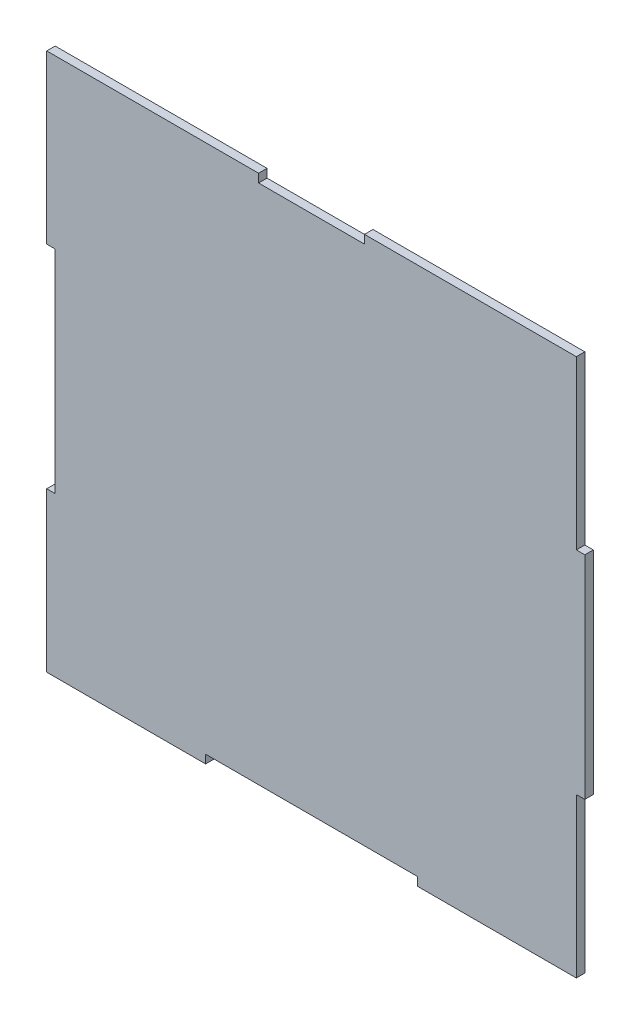
ISO-10303-21;
HEADER;
FILE_DESCRIPTION(('STEP AP214'),'2;1');
FILE_NAME('part.step','',(''),(''),'','','');
FILE_SCHEMA(('AUTOMOTIVE_DESIGN { 1 0 10303 214 1 1 1 1 }'));
ENDSEC;
DATA;
#1=APPLICATION_CONTEXT('core data for automotive mechanical design processes');
#2=APPLICATION_PROTOCOL_DEFINITION('international standard','automotive_design',2000,#1);
#3=PRODUCT_CONTEXT('',#1,'mechanical');
#4=PRODUCT('Part','Part','',(#3));
#5=PRODUCT_RELATED_PRODUCT_CATEGORY('part','',(#4));
#6=PRODUCT_DEFINITION_FORMATION('','',#4);
#7=PRODUCT_DEFINITION_CONTEXT('part definition',#1,'design');
#8=PRODUCT_DEFINITION('design','',#6,#7);
#9=PRODUCT_DEFINITION_SHAPE('','',#8);
#10=(LENGTH_UNIT() NAMED_UNIT(*) SI_UNIT(.MILLI.,.METRE.));
#11=(NAMED_UNIT(*) PLANE_ANGLE_UNIT() SI_UNIT($,.RADIAN.));
#12=(NAMED_UNIT(*) SI_UNIT($,.STERADIAN.) SOLID_ANGLE_UNIT());
#13=UNCERTAINTY_MEASURE_WITH_UNIT(LENGTH_MEASURE(1.E-05),#10,'distance_accuracy_value','');
#14=(GEOMETRIC_REPRESENTATION_CONTEXT(3) GLOBAL_UNCERTAINTY_ASSIGNED_CONTEXT((#13)) GLOBAL_UNIT_ASSIGNED_CONTEXT((#10,
#11,#12)) REPRESENTATION_CONTEXT('',''));
#15=CARTESIAN_POINT('',(0.,0.,0.));
#16=DIRECTION('',(0.,0.,1.));
#17=DIRECTION('',(1.,0.,0.));
#18=AXIS2_PLACEMENT_3D('',#15,#16,#17);
#19=CARTESIAN_POINT('',(-77.1815206878133,-124.72771896828,4.));
#20=DIRECTION('',(0.,1.,0.));
#21=DIRECTION('',(0.,0.,1.));
#22=AXIS2_PLACEMENT_3D('',#19,#20,#21);
#23=PLANE('',#22);
#24=DIRECTION('',(1.,0.,0.));
#25=VECTOR('',#24,1.);
#26=CARTESIAN_POINT('',(-77.1815206878133,-124.72771896828,0.));
#27=LINE('',#26,#25);
#28=CARTESIAN_POINT('',(-77.1815206878133,-124.72771896828,0.));
#29=VERTEX_POINT('',#28);
#30=CARTESIAN_POINT('',(-2.18152068781335,-124.72771896828,0.));
#31=VERTEX_POINT('',#30);
#32=EDGE_CURVE('E211',#29,#31,#27,.T.);
#33=ORIENTED_EDGE('',*,*,#32,.T.);
#34=DIRECTION('',(0.,0.,-1.));
#35=VECTOR('',#34,1.);
#36=CARTESIAN_POINT('',(-2.18152068781335,-124.72771896828,4.));
#37=LINE('',#36,#35);
#38=CARTESIAN_POINT('',(-2.18152068781335,-124.72771896828,4.));
#39=VERTEX_POINT('',#38);
#40=EDGE_CURVE('E11',#39,#31,#37,.T.);
#41=ORIENTED_EDGE('',*,*,#40,.F.);
#42=DIRECTION('',(1.,0.,0.));
#43=VECTOR('',#42,1.);
#44=CARTESIAN_POINT('',(-77.1815206878133,-124.72771896828,4.));
#45=LINE('',#44,#43);
#46=CARTESIAN_POINT('',(-77.1815206878133,-124.72771896828,4.));
#47=VERTEX_POINT('',#46);
#48=EDGE_CURVE('E251',#47,#39,#45,.T.);
#49=ORIENTED_EDGE('',*,*,#48,.F.);
#50=DIRECTION('',(0.,0.,-1.));
#51=VECTOR('',#50,1.);
#52=CARTESIAN_POINT('',(-77.1815206878133,-124.72771896828,4.));
#53=LINE('',#52,#51);
#54=EDGE_CURVE('E207',#47,#29,#53,.T.);
#55=ORIENTED_EDGE('',*,*,#54,.T.);
#56=EDGE_LOOP('',(#33,#41,#49,#55));
#57=FACE_BOUND('',#56,.T.);
#58=ADVANCED_FACE('F43',(#57),#23,.F.);
#59=CARTESIAN_POINT('',(-2.18152068781335,-124.72771896828,4.));
#60=DIRECTION('',(-1.,0.,0.));
#61=DIRECTION('',(0.,0.,1.));
#62=AXIS2_PLACEMENT_3D('',#59,#60,#61);
#63=PLANE('',#62);
#64=DIRECTION('',(0.,1.,0.));
#65=VECTOR('',#64,1.);
#66=CARTESIAN_POINT('',(-2.18152068781335,-124.72771896828,0.));
#67=LINE('',#66,#65);
#68=CARTESIAN_POINT('',(-2.18152068781335,-49.72771896828,0.));
#69=VERTEX_POINT('',#68);
#70=EDGE_CURVE('E214',#31,#69,#67,.T.);
#71=ORIENTED_EDGE('',*,*,#70,.T.);
#72=DIRECTION('',(0.,0.,-1.));
#73=VECTOR('',#72,1.);
#74=CARTESIAN_POINT('',(-2.18152068781335,-49.72771896828,4.));
#75=LINE('',#74,#73);
#76=CARTESIAN_POINT('',(-2.18152068781335,-49.72771896828,4.));
#77=VERTEX_POINT('',#76);
#78=EDGE_CURVE('E51',#77,#69,#75,.T.);
#79=ORIENTED_EDGE('',*,*,#78,.F.);
#80=DIRECTION('',(0.,1.,0.));
#81=VECTOR('',#80,1.);
#82=CARTESIAN_POINT('',(-2.18152068781335,-124.72771896828,4.));
#83=LINE('',#82,#81);
#84=EDGE_CURVE('E138',#39,#77,#83,.T.);
#85=ORIENTED_EDGE('',*,*,#84,.F.);
#86=ORIENTED_EDGE('',*,*,#40,.T.);
#87=EDGE_LOOP('',(#71,#79,#85,#86));
#88=FACE_BOUND('',#87,.T.);
#89=ADVANCED_FACE('F368',(#88),#63,.F.);
#90=CARTESIAN_POINT('',(-2.18152068781335,-49.72771896828,4.));
#91=DIRECTION('',(0.,1.,0.));
#92=DIRECTION('',(0.,0.,1.));
#93=AXIS2_PLACEMENT_3D('',#90,#91,#92);
#94=PLANE('',#93);
#95=DIRECTION('',(1.,0.,0.));
#96=VECTOR('',#95,1.);
#97=CARTESIAN_POINT('',(-2.18152068781335,-49.72771896828,0.));
#98=LINE('',#97,#96);
#99=CARTESIAN_POINT('',(1.81847931218665,-49.72771896828,0.));
#100=VERTEX_POINT('',#99);
#101=EDGE_CURVE('E216',#69,#100,#98,.T.);
#102=ORIENTED_EDGE('',*,*,#101,.T.);
#103=DIRECTION('',(0.,0.,-1.));
#104=VECTOR('',#103,1.);
#105=CARTESIAN_POINT('',(1.81847931218665,-49.72771896828,4.));
#106=LINE('',#105,#104);
#107=CARTESIAN_POINT('',(1.81847931218665,-49.72771896828,4.));
#108=VERTEX_POINT('',#107);
#109=EDGE_CURVE('E294',#108,#100,#106,.T.);
#110=ORIENTED_EDGE('',*,*,#109,.F.);
#111=DIRECTION('',(1.,0.,0.));
#112=VECTOR('',#111,1.);
#113=CARTESIAN_POINT('',(-2.18152068781335,-49.72771896828,4.));
#114=LINE('',#113,#112);
#115=EDGE_CURVE('E302',#77,#108,#114,.T.);
#116=ORIENTED_EDGE('',*,*,#115,.F.);
#117=ORIENTED_EDGE('',*,*,#78,.T.);
#118=EDGE_LOOP('',(#102,#110,#116,#117));
#119=FACE_BOUND('',#118,.T.);
#120=ADVANCED_FACE('F300',(#119),#94,.F.);
#121=CARTESIAN_POINT('',(1.81847931218665,-49.72771896828,4.));
#122=DIRECTION('',(-1.,0.,0.));
#123=DIRECTION('',(0.,0.,1.));
#124=AXIS2_PLACEMENT_3D('',#121,#122,#123);
#125=PLANE('',#124);
#126=DIRECTION('',(0.,1.,0.));
#127=VECTOR('',#126,1.);
#128=CARTESIAN_POINT('',(1.81847931218665,-49.72771896828,0.));
#129=LINE('',#128,#127);
#130=CARTESIAN_POINT('',(1.81847931218665,50.27228103172,0.));
#131=VERTEX_POINT('',#130);
#132=EDGE_CURVE('E218',#100,#131,#129,.T.);
#133=ORIENTED_EDGE('',*,*,#132,.T.);
#134=DIRECTION('',(0.,0.,-1.));
#135=VECTOR('',#134,1.);
#136=CARTESIAN_POINT('',(1.81847931218665,50.27228103172,4.));
#137=LINE('',#136,#135);
#138=CARTESIAN_POINT('',(1.81847931218665,50.27228103172,4.));
#139=VERTEX_POINT('',#138);
#140=EDGE_CURVE('E291',#139,#131,#137,.T.);
#141=ORIENTED_EDGE('',*,*,#140,.F.);
#142=DIRECTION('',(0.,1.,0.));
#143=VECTOR('',#142,1.);
#144=CARTESIAN_POINT('',(1.81847931218665,-49.72771896828,4.));
#145=LINE('',#144,#143);
#146=EDGE_CURVE('E319',#108,#139,#145,.T.);
#147=ORIENTED_EDGE('',*,*,#146,.F.);
#148=ORIENTED_EDGE('',*,*,#109,.T.);
#149=EDGE_LOOP('',(#133,#141,#147,#148));
#150=FACE_BOUND('',#149,.T.);
#151=ADVANCED_FACE('F310',(#150),#125,.F.);
#152=CARTESIAN_POINT('',(1.81847931218665,50.27228103172,4.));
#153=DIRECTION('',(0.,-1.,0.));
#154=DIRECTION('',(0.,0.,-1.));
#155=AXIS2_PLACEMENT_3D('',#152,#153,#154);
#156=PLANE('',#155);
#157=DIRECTION('',(-1.,0.,0.));
#158=VECTOR('',#157,1.);
#159=CARTESIAN_POINT('',(1.81847931218665,50.27228103172,0.));
#160=LINE('',#159,#158);
#161=CARTESIAN_POINT('',(-2.18152068781335,50.27228103172,0.));
#162=VERTEX_POINT('',#161);
#163=EDGE_CURVE('E220',#131,#162,#160,.T.);
#164=ORIENTED_EDGE('',*,*,#163,.T.);
#165=DIRECTION('',(0.,0.,-1.));
#166=VECTOR('',#165,1.);
#167=CARTESIAN_POINT('',(-2.18152068781335,50.27228103172,4.));
#168=LINE('',#167,#166);
#169=CARTESIAN_POINT('',(-2.18152068781335,50.27228103172,4.));
#170=VERTEX_POINT('',#169);
#171=EDGE_CURVE('E288',#170,#162,#168,.T.);
#172=ORIENTED_EDGE('',*,*,#171,.F.);
#173=DIRECTION('',(-1.,0.,0.));
#174=VECTOR('',#173,1.);
#175=CARTESIAN_POINT('',(1.81847931218665,50.27228103172,4.));
#176=LINE('',#175,#174);
#177=EDGE_CURVE('E316',#139,#170,#176,.T.);
#178=ORIENTED_EDGE('',*,*,#177,.F.);
#179=ORIENTED_EDGE('',*,*,#140,.T.);
#180=EDGE_LOOP('',(#164,#172,#178,#179));
#181=FACE_BOUND('',#180,.T.);
#182=ADVANCED_FACE('F314',(#181),#156,.F.);
#183=CARTESIAN_POINT('',(-2.18152068781335,129.27228103172,4.));
#184=DIRECTION('',(-1.,0.,0.));
#185=DIRECTION('',(0.,0.,1.));
#186=AXIS2_PLACEMENT_3D('',#183,#184,#185);
#187=PLANE('',#186);
#188=DIRECTION('',(0.,1.,0.));
#189=VECTOR('',#188,1.);
#190=CARTESIAN_POINT('',(-2.18152068781335,129.27228103172,0.));
#191=LINE('',#190,#189);
#192=CARTESIAN_POINT('',(-2.18152068781335,129.27228103172,0.));
#193=VERTEX_POINT('',#192);
#194=EDGE_CURVE('E223',#162,#193,#191,.T.);
#195=ORIENTED_EDGE('',*,*,#194,.T.);
#196=DIRECTION('',(0.,0.,-1.));
#197=VECTOR('',#196,1.);
#198=CARTESIAN_POINT('',(-2.18152068781335,129.27228103172,4.));
#199=LINE('',#198,#197);
#200=CARTESIAN_POINT('',(-2.18152068781335,129.27228103172,4.));
#201=VERTEX_POINT('',#200);
#202=EDGE_CURVE('E285',#201,#193,#199,.T.);
#203=ORIENTED_EDGE('',*,*,#202,.F.);
#204=DIRECTION('',(0.,1.,0.));
#205=VECTOR('',#204,1.);
#206=CARTESIAN_POINT('',(-2.18152068781335,50.27228103172,4.));
#207=LINE('',#206,#205);
#208=EDGE_CURVE('E318',#170,#201,#207,.T.);
#209=ORIENTED_EDGE('',*,*,#208,.F.);
#210=ORIENTED_EDGE('',*,*,#171,.T.);
#211=EDGE_LOOP('',(#195,#203,#209,#210));
#212=FACE_BOUND('',#211,.T.);
#213=ADVANCED_FACE('F381',(#212),#187,.F.);
#214=CARTESIAN_POINT('',(-102.181520687813,129.27228103172,4.));
#215=DIRECTION('',(0.,-1.,0.));
#216=DIRECTION('',(0.,0.,-1.));
#217=AXIS2_PLACEMENT_3D('',#214,#215,#216);
#218=PLANE('',#217);
#219=DIRECTION('',(-1.,0.,0.));
#220=VECTOR('',#219,1.);
#221=CARTESIAN_POINT('',(-102.181520687813,129.27228103172,0.));
#222=LINE('',#221,#220);
#223=CARTESIAN_POINT('',(-102.181520687813,129.27228103172,0.));
#224=VERTEX_POINT('',#223);
#225=EDGE_CURVE('E225',#193,#224,#222,.T.);
#226=ORIENTED_EDGE('',*,*,#225,.T.);
#227=DIRECTION('',(0.,0.,-1.));
#228=VECTOR('',#227,1.);
#229=CARTESIAN_POINT('',(-102.181520687813,129.27228103172,4.));
#230=LINE('',#229,#228);
#231=CARTESIAN_POINT('',(-102.181520687813,129.27228103172,4.));
#232=VERTEX_POINT('',#231);
#233=EDGE_CURVE('E282',#232,#224,#230,.T.);
#234=ORIENTED_EDGE('',*,*,#233,.F.);
#235=DIRECTION('',(-1.,0.,0.));
#236=VECTOR('',#235,1.);
#237=CARTESIAN_POINT('',(-102.181520687813,129.27228103172,4.));
#238=LINE('',#237,#236);
#239=EDGE_CURVE('E321',#201,#232,#238,.T.);
#240=ORIENTED_EDGE('',*,*,#239,.F.);
#241=ORIENTED_EDGE('',*,*,#202,.T.);
#242=EDGE_LOOP('',(#226,#234,#240,#241));
#243=FACE_BOUND('',#242,.T.);
#244=ADVANCED_FACE('F384',(#243),#218,.F.);
#245=CARTESIAN_POINT('',(-102.181520687813,125.27228103172,4.));
#246=DIRECTION('',(1.,0.,0.));
#247=DIRECTION('',(0.,0.,-1.));
#248=AXIS2_PLACEMENT_3D('',#245,#246,#247);
#249=PLANE('',#248);
#250=DIRECTION('',(0.,-1.,0.));
#251=VECTOR('',#250,1.);
#252=CARTESIAN_POINT('',(-102.181520687813,125.27228103172,0.));
#253=LINE('',#252,#251);
#254=CARTESIAN_POINT('',(-102.181520687813,125.27228103172,0.));
#255=VERTEX_POINT('',#254);
#256=EDGE_CURVE('E227',#224,#255,#253,.T.);
#257=ORIENTED_EDGE('',*,*,#256,.T.);
#258=DIRECTION('',(0.,0.,-1.));
#259=VECTOR('',#258,1.);
#260=CARTESIAN_POINT('',(-102.181520687813,125.27228103172,4.));
#261=LINE('',#260,#259);
#262=CARTESIAN_POINT('',(-102.181520687813,125.27228103172,4.));
#263=VERTEX_POINT('',#262);
#264=EDGE_CURVE('E279',#263,#255,#261,.T.);
#265=ORIENTED_EDGE('',*,*,#264,.F.);
#266=DIRECTION('',(0.,-1.,0.));
#267=VECTOR('',#266,1.);
#268=CARTESIAN_POINT('',(-102.181520687813,125.27228103172,4.));
#269=LINE('',#268,#267);
#270=EDGE_CURVE('E327',#232,#263,#269,.T.);
#271=ORIENTED_EDGE('',*,*,#270,.F.);
#272=ORIENTED_EDGE('',*,*,#233,.T.);
#273=EDGE_LOOP('',(#257,#265,#271,#272));
#274=FACE_BOUND('',#273,.T.);
#275=ADVANCED_FACE('F388',(#274),#249,.F.);
#276=CARTESIAN_POINT('',(-152.181520687813,125.27228103172,4.));
#277=DIRECTION('',(0.,-1.,0.));
#278=DIRECTION('',(0.,0.,-1.));
#279=AXIS2_PLACEMENT_3D('',#276,#277,#278);
#280=PLANE('',#279);
#281=DIRECTION('',(-1.,0.,0.));
#282=VECTOR('',#281,1.);
#283=CARTESIAN_POINT('',(-152.181520687813,125.27228103172,0.));
#284=LINE('',#283,#282);
#285=CARTESIAN_POINT('',(-152.181520687813,125.27228103172,0.));
#286=VERTEX_POINT('',#285);
#287=EDGE_CURVE('E229',#255,#286,#284,.T.);
#288=ORIENTED_EDGE('',*,*,#287,.T.);
#289=DIRECTION('',(0.,0.,-1.));
#290=VECTOR('',#289,1.);
#291=CARTESIAN_POINT('',(-152.181520687813,125.27228103172,4.));
#292=LINE('',#291,#290);
#293=CARTESIAN_POINT('',(-152.181520687813,125.27228103172,4.));
#294=VERTEX_POINT('',#293);
#295=EDGE_CURVE('E276',#294,#286,#292,.T.);
#296=ORIENTED_EDGE('',*,*,#295,.F.);
#297=DIRECTION('',(-1.,0.,0.));
#298=VECTOR('',#297,1.);
#299=CARTESIAN_POINT('',(-152.181520687813,125.27228103172,4.));
#300=LINE('',#299,#298);
#301=EDGE_CURVE('E329',#263,#294,#300,.T.);
#302=ORIENTED_EDGE('',*,*,#301,.F.);
#303=ORIENTED_EDGE('',*,*,#264,.T.);
#304=EDGE_LOOP('',(#288,#296,#302,#303));
#305=FACE_BOUND('',#304,.T.);
#306=ADVANCED_FACE('F392',(#305),#280,.F.);
#307=CARTESIAN_POINT('',(-152.181520687813,129.27228103172,4.));
#308=DIRECTION('',(-1.,0.,0.));
#309=DIRECTION('',(0.,0.,1.));
#310=AXIS2_PLACEMENT_3D('',#307,#308,#309);
#311=PLANE('',#310);
#312=DIRECTION('',(0.,1.,0.));
#313=VECTOR('',#312,1.);
#314=CARTESIAN_POINT('',(-152.181520687813,129.27228103172,0.));
#315=LINE('',#314,#313);
#316=CARTESIAN_POINT('',(-152.181520687813,129.27228103172,0.));
#317=VERTEX_POINT('',#316);
#318=EDGE_CURVE('E231',#286,#317,#315,.T.);
#319=ORIENTED_EDGE('',*,*,#318,.T.);
#320=DIRECTION('',(0.,0.,-1.));
#321=VECTOR('',#320,1.);
#322=CARTESIAN_POINT('',(-152.181520687813,129.27228103172,4.));
#323=LINE('',#322,#321);
#324=CARTESIAN_POINT('',(-152.181520687813,129.27228103172,4.));
#325=VERTEX_POINT('',#324);
#326=EDGE_CURVE('E273',#325,#317,#323,.T.);
#327=ORIENTED_EDGE('',*,*,#326,.F.);
#328=DIRECTION('',(0.,1.,0.));
#329=VECTOR('',#328,1.);
#330=CARTESIAN_POINT('',(-152.181520687813,129.27228103172,4.));
#331=LINE('',#330,#329);
#332=EDGE_CURVE('E331',#294,#325,#331,.T.);
#333=ORIENTED_EDGE('',*,*,#332,.F.);
#334=ORIENTED_EDGE('',*,*,#295,.T.);
#335=EDGE_LOOP('',(#319,#327,#333,#334));
#336=FACE_BOUND('',#335,.T.);
#337=ADVANCED_FACE('F396',(#336),#311,.F.);
#338=CARTESIAN_POINT('',(-252.181520687813,129.27228103172,4.));
#339=DIRECTION('',(0.,-1.,0.));
#340=DIRECTION('',(1.,0.,0.));
#341=AXIS2_PLACEMENT_3D('',#338,#339,#340);
#342=PLANE('',#341);
#343=DIRECTION('',(-1.,0.,0.));
#344=VECTOR('',#343,1.);
#345=CARTESIAN_POINT('',(-252.181520687813,129.27228103172,0.));
#346=LINE('',#345,#344);
#347=CARTESIAN_POINT('',(-252.181520687813,129.27228103172,0.));
#348=VERTEX_POINT('',#347);
#349=EDGE_CURVE('E233',#317,#348,#346,.T.);
#350=ORIENTED_EDGE('',*,*,#349,.T.);
#351=DIRECTION('',(0.,0.,-1.));
#352=VECTOR('',#351,1.);
#353=CARTESIAN_POINT('',(-252.181520687813,129.27228103172,4.));
#354=LINE('',#353,#352);
#355=CARTESIAN_POINT('',(-252.181520687813,129.27228103172,4.));
#356=VERTEX_POINT('',#355);
#357=EDGE_CURVE('E270',#356,#348,#354,.T.);
#358=ORIENTED_EDGE('',*,*,#357,.F.);
#359=DIRECTION('',(-1.,0.,0.));
#360=VECTOR('',#359,1.);
#361=CARTESIAN_POINT('',(-252.181520687813,129.27228103172,4.));
#362=LINE('',#361,#360);
#363=EDGE_CURVE('E333',#325,#356,#362,.T.);
#364=ORIENTED_EDGE('',*,*,#363,.F.);
#365=ORIENTED_EDGE('',*,*,#326,.T.);
#366=EDGE_LOOP('',(#350,#358,#364,#365));
#367=FACE_BOUND('',#366,.T.);
#368=ADVANCED_FACE('F400',(#367),#342,.F.);
#369=CARTESIAN_POINT('',(-252.181520687813,125.27228103172,4.));
#370=DIRECTION('',(1.,0.,0.));
#371=DIRECTION('',(0.,0.,-1.));
#372=AXIS2_PLACEMENT_3D('',#369,#370,#371);
#373=PLANE('',#372);
#374=DIRECTION('',(0.,-1.,0.));
#375=VECTOR('',#374,1.);
#376=CARTESIAN_POINT('',(-252.181520687813,125.27228103172,0.));
#377=LINE('',#376,#375);
#378=CARTESIAN_POINT('',(-252.181520687813,50.27228103172,0.));
#379=VERTEX_POINT('',#378);
#380=EDGE_CURVE('E236',#348,#379,#377,.T.);
#381=ORIENTED_EDGE('',*,*,#380,.T.);
#382=DIRECTION('',(0.,0.,-1.));
#383=VECTOR('',#382,1.);
#384=CARTESIAN_POINT('',(-252.181520687813,50.27228103172,4.));
#385=LINE('',#384,#383);
#386=CARTESIAN_POINT('',(-252.181520687813,50.27228103172,4.));
#387=VERTEX_POINT('',#386);
#388=EDGE_CURVE('E267',#387,#379,#385,.T.);
#389=ORIENTED_EDGE('',*,*,#388,.F.);
#390=DIRECTION('',(0.,-1.,0.));
#391=VECTOR('',#390,1.);
#392=CARTESIAN_POINT('',(-252.181520687813,125.27228103172,4.));
#393=LINE('',#392,#391);
#394=EDGE_CURVE('E335',#356,#387,#393,.T.);
#395=ORIENTED_EDGE('',*,*,#394,.F.);
#396=ORIENTED_EDGE('',*,*,#357,.T.);
#397=EDGE_LOOP('',(#381,#389,#395,#396));
#398=FACE_BOUND('',#397,.T.);
#399=ADVANCED_FACE('F404',(#398),#373,.F.);
#400=CARTESIAN_POINT('',(-252.181520687813,50.27228103172,4.));
#401=DIRECTION('',(0.,1.,0.));
#402=DIRECTION('',(0.,0.,1.));
#403=AXIS2_PLACEMENT_3D('',#400,#401,#402);
#404=PLANE('',#403);
#405=DIRECTION('',(1.,0.,0.));
#406=VECTOR('',#405,1.);
#407=CARTESIAN_POINT('',(-252.181520687813,50.27228103172,0.));
#408=LINE('',#407,#406);
#409=CARTESIAN_POINT('',(-248.181520687813,50.27228103172,0.));
#410=VERTEX_POINT('',#409);
#411=EDGE_CURVE('E238',#379,#410,#408,.T.);
#412=ORIENTED_EDGE('',*,*,#411,.T.);
#413=DIRECTION('',(0.,0.,-1.));
#414=VECTOR('',#413,1.);
#415=CARTESIAN_POINT('',(-248.181520687813,50.27228103172,4.));
#416=LINE('',#415,#414);
#417=CARTESIAN_POINT('',(-248.181520687813,50.27228103172,4.));
#418=VERTEX_POINT('',#417);
#419=EDGE_CURVE('E264',#418,#410,#416,.T.);
#420=ORIENTED_EDGE('',*,*,#419,.F.);
#421=DIRECTION('',(1.,0.,0.));
#422=VECTOR('',#421,1.);
#423=CARTESIAN_POINT('',(-252.181520687813,50.27228103172,4.));
#424=LINE('',#423,#422);
#425=EDGE_CURVE('E337',#387,#418,#424,.T.);
#426=ORIENTED_EDGE('',*,*,#425,.F.);
#427=ORIENTED_EDGE('',*,*,#388,.T.);
#428=EDGE_LOOP('',(#412,#420,#426,#427));
#429=FACE_BOUND('',#428,.T.);
#430=ADVANCED_FACE('F408',(#429),#404,.F.);
#431=CARTESIAN_POINT('',(-248.181520687813,50.27228103172,4.));
#432=DIRECTION('',(1.,0.,0.));
#433=DIRECTION('',(0.,0.,-1.));
#434=AXIS2_PLACEMENT_3D('',#431,#432,#433);
#435=PLANE('',#434);
#436=DIRECTION('',(0.,-1.,0.));
#437=VECTOR('',#436,1.);
#438=CARTESIAN_POINT('',(-248.181520687813,50.27228103172,0.));
#439=LINE('',#438,#437);
#440=CARTESIAN_POINT('',(-248.181520687813,-49.72771896828,0.));
#441=VERTEX_POINT('',#440);
#442=EDGE_CURVE('E240',#410,#441,#439,.T.);
#443=ORIENTED_EDGE('',*,*,#442,.T.);
#444=DIRECTION('',(0.,0.,-1.));
#445=VECTOR('',#444,1.);
#446=CARTESIAN_POINT('',(-248.181520687813,-49.72771896828,4.));
#447=LINE('',#446,#445);
#448=CARTESIAN_POINT('',(-248.181520687813,-49.72771896828,4.));
#449=VERTEX_POINT('',#448);
#450=EDGE_CURVE('E261',#449,#441,#447,.T.);
#451=ORIENTED_EDGE('',*,*,#450,.F.);
#452=DIRECTION('',(0.,-1.,0.));
#453=VECTOR('',#452,1.);
#454=CARTESIAN_POINT('',(-248.181520687813,50.27228103172,4.));
#455=LINE('',#454,#453);
#456=EDGE_CURVE('E339',#418,#449,#455,.T.);
#457=ORIENTED_EDGE('',*,*,#456,.F.);
#458=ORIENTED_EDGE('',*,*,#419,.T.);
#459=EDGE_LOOP('',(#443,#451,#457,#458));
#460=FACE_BOUND('',#459,.T.);
#461=ADVANCED_FACE('F412',(#460),#435,.F.);
#462=CARTESIAN_POINT('',(-248.181520687813,-49.72771896828,4.));
#463=DIRECTION('',(0.,-1.,0.));
#464=DIRECTION('',(0.,0.,-1.));
#465=AXIS2_PLACEMENT_3D('',#462,#463,#464);
#466=PLANE('',#465);
#467=DIRECTION('',(-1.,0.,0.));
#468=VECTOR('',#467,1.);
#469=CARTESIAN_POINT('',(-248.181520687813,-49.72771896828,0.));
#470=LINE('',#469,#468);
#471=CARTESIAN_POINT('',(-252.181520687813,-49.72771896828,0.));
#472=VERTEX_POINT('',#471);
#473=EDGE_CURVE('E242',#441,#472,#470,.T.);
#474=ORIENTED_EDGE('',*,*,#473,.T.);
#475=DIRECTION('',(0.,0.,-1.));
#476=VECTOR('',#475,1.);
#477=CARTESIAN_POINT('',(-252.181520687813,-49.72771896828,4.));
#478=LINE('',#477,#476);
#479=CARTESIAN_POINT('',(-252.181520687813,-49.72771896828,4.));
#480=VERTEX_POINT('',#479);
#481=EDGE_CURVE('E258',#480,#472,#478,.T.);
#482=ORIENTED_EDGE('',*,*,#481,.F.);
#483=DIRECTION('',(-1.,0.,0.));
#484=VECTOR('',#483,1.);
#485=CARTESIAN_POINT('',(-248.181520687813,-49.72771896828,4.));
#486=LINE('',#485,#484);
#487=EDGE_CURVE('E341',#449,#480,#486,.T.);
#488=ORIENTED_EDGE('',*,*,#487,.F.);
#489=ORIENTED_EDGE('',*,*,#450,.T.);
#490=EDGE_LOOP('',(#474,#482,#488,#489));
#491=FACE_BOUND('',#490,.T.);
#492=ADVANCED_FACE('F416',(#491),#466,.F.);
#493=CARTESIAN_POINT('',(-252.181520687813,-49.72771896828,4.));
#494=DIRECTION('',(1.,0.,0.));
#495=DIRECTION('',(0.,0.,-1.));
#496=AXIS2_PLACEMENT_3D('',#493,#494,#495);
#497=PLANE('',#496);
#498=DIRECTION('',(0.,-1.,0.));
#499=VECTOR('',#498,1.);
#500=CARTESIAN_POINT('',(-252.181520687813,-49.72771896828,0.));
#501=LINE('',#500,#499);
#502=CARTESIAN_POINT('',(-252.181520687813,-124.72771896828,0.));
#503=VERTEX_POINT('',#502);
#504=EDGE_CURVE('E244',#472,#503,#501,.T.);
#505=ORIENTED_EDGE('',*,*,#504,.T.);
#506=DIRECTION('',(0.,0.,-1.));
#507=VECTOR('',#506,1.);
#508=CARTESIAN_POINT('',(-252.181520687813,-124.72771896828,4.));
#509=LINE('',#508,#507);
#510=CARTESIAN_POINT('',(-252.181520687813,-124.72771896828,4.));
#511=VERTEX_POINT('',#510);
#512=EDGE_CURVE('E255',#511,#503,#509,.T.);
#513=ORIENTED_EDGE('',*,*,#512,.F.);
#514=DIRECTION('',(0.,-1.,0.));
#515=VECTOR('',#514,1.);
#516=CARTESIAN_POINT('',(-252.181520687813,-49.72771896828,4.));
#517=LINE('',#516,#515);
#518=EDGE_CURVE('E343',#480,#511,#517,.T.);
#519=ORIENTED_EDGE('',*,*,#518,.F.);
#520=ORIENTED_EDGE('',*,*,#481,.T.);
#521=EDGE_LOOP('',(#505,#513,#519,#520));
#522=FACE_BOUND('',#521,.T.);
#523=ADVANCED_FACE('F349',(#522),#497,.F.);
#524=CARTESIAN_POINT('',(-252.181520687813,-124.72771896828,4.));
#525=DIRECTION('',(0.,1.,0.));
#526=DIRECTION('',(0.,0.,1.));
#527=AXIS2_PLACEMENT_3D('',#524,#525,#526);
#528=PLANE('',#527);
#529=DIRECTION('',(1.,0.,0.));
#530=VECTOR('',#529,1.);
#531=CARTESIAN_POINT('',(-252.181520687813,-124.72771896828,0.));
#532=LINE('',#531,#530);
#533=CARTESIAN_POINT('',(-177.181520687813,-124.72771896828,0.));
#534=VERTEX_POINT('',#533);
#535=EDGE_CURVE('E246',#503,#534,#532,.T.);
#536=ORIENTED_EDGE('',*,*,#535,.T.);
#537=DIRECTION('',(0.,0.,-1.));
#538=VECTOR('',#537,1.);
#539=CARTESIAN_POINT('',(-177.181520687813,-124.72771896828,4.));
#540=LINE('',#539,#538);
#541=CARTESIAN_POINT('',(-177.181520687813,-124.72771896828,4.));
#542=VERTEX_POINT('',#541);
#543=EDGE_CURVE('E202',#542,#534,#540,.T.);
#544=ORIENTED_EDGE('',*,*,#543,.F.);
#545=DIRECTION('',(1.,0.,0.));
#546=VECTOR('',#545,1.);
#547=CARTESIAN_POINT('',(-252.181520687813,-124.72771896828,4.));
#548=LINE('',#547,#546);
#549=EDGE_CURVE('E193',#511,#542,#548,.T.);
#550=ORIENTED_EDGE('',*,*,#549,.F.);
#551=ORIENTED_EDGE('',*,*,#512,.T.);
#552=EDGE_LOOP('',(#536,#544,#550,#551));
#553=FACE_BOUND('',#552,.T.);
#554=ADVANCED_FACE('F353',(#553),#528,.F.);
#555=CARTESIAN_POINT('',(-177.181520687813,-124.72771896828,4.));
#556=DIRECTION('',(-1.,0.,0.));
#557=DIRECTION('',(0.,0.,1.));
#558=AXIS2_PLACEMENT_3D('',#555,#556,#557);
#559=PLANE('',#558);
#560=DIRECTION('',(0.,1.,0.));
#561=VECTOR('',#560,1.);
#562=CARTESIAN_POINT('',(-177.181520687813,-124.72771896828,0.));
#563=LINE('',#562,#561);
#564=CARTESIAN_POINT('',(-177.181520687813,-120.72771896828,0.));
#565=VERTEX_POINT('',#564);
#566=EDGE_CURVE('E201',#534,#565,#563,.T.);
#567=ORIENTED_EDGE('',*,*,#566,.T.);
#568=DIRECTION('',(0.,0.,-1.));
#569=VECTOR('',#568,1.);
#570=CARTESIAN_POINT('',(-177.181520687813,-120.72771896828,4.));
#571=LINE('',#570,#569);
#572=CARTESIAN_POINT('',(-177.181520687813,-120.72771896828,4.));
#573=VERTEX_POINT('',#572);
#574=EDGE_CURVE('E198',#573,#565,#571,.T.);
#575=ORIENTED_EDGE('',*,*,#574,.F.);
#576=DIRECTION('',(0.,1.,0.));
#577=VECTOR('',#576,1.);
#578=CARTESIAN_POINT('',(-177.181520687813,-124.72771896828,4.));
#579=LINE('',#578,#577);
#580=EDGE_CURVE('E187',#542,#573,#579,.T.);
#581=ORIENTED_EDGE('',*,*,#580,.F.);
#582=ORIENTED_EDGE('',*,*,#543,.T.);
#583=EDGE_LOOP('',(#567,#575,#581,#582));
#584=FACE_BOUND('',#583,.T.);
#585=ADVANCED_FACE('F199',(#584),#559,.F.);
#586=CARTESIAN_POINT('',(-177.181520687813,-120.72771896828,4.));
#587=DIRECTION('',(0.,1.,0.));
#588=DIRECTION('',(0.,0.,1.));
#589=AXIS2_PLACEMENT_3D('',#586,#587,#588);
#590=PLANE('',#589);
#591=DIRECTION('',(1.,0.,0.));
#592=VECTOR('',#591,1.);
#593=CARTESIAN_POINT('',(-177.181520687813,-120.72771896828,0.));
#594=LINE('',#593,#592);
#595=CARTESIAN_POINT('',(-77.1815206878133,-120.72771896828,0.));
#596=VERTEX_POINT('',#595);
#597=EDGE_CURVE('E124',#565,#596,#594,.T.);
#598=ORIENTED_EDGE('',*,*,#597,.T.);
#599=DIRECTION('',(0.,0.,-1.));
#600=VECTOR('',#599,1.);
#601=CARTESIAN_POINT('',(-77.1815206878133,-120.72771896828,4.));
#602=LINE('',#601,#600);
#603=CARTESIAN_POINT('',(-77.1815206878133,-120.72771896828,4.));
#604=VERTEX_POINT('',#603);
#605=EDGE_CURVE('E203',#604,#596,#602,.T.);
#606=ORIENTED_EDGE('',*,*,#605,.F.);
#607=DIRECTION('',(1.,0.,0.));
#608=VECTOR('',#607,1.);
#609=CARTESIAN_POINT('',(-177.181520687813,-120.72771896828,4.));
#610=LINE('',#609,#608);
#611=EDGE_CURVE('E191',#573,#604,#610,.T.);
#612=ORIENTED_EDGE('',*,*,#611,.F.);
#613=ORIENTED_EDGE('',*,*,#574,.T.);
#614=EDGE_LOOP('',(#598,#606,#612,#613));
#615=FACE_BOUND('',#614,.T.);
#616=ADVANCED_FACE('F205',(#615),#590,.F.);
#617=CARTESIAN_POINT('',(-77.1815206878133,-120.72771896828,4.));
#618=DIRECTION('',(1.,0.,0.));
#619=DIRECTION('',(0.,0.,-1.));
#620=AXIS2_PLACEMENT_3D('',#617,#618,#619);
#621=PLANE('',#620);
#622=DIRECTION('',(0.,-1.,0.));
#623=VECTOR('',#622,1.);
#624=CARTESIAN_POINT('',(-77.1815206878133,-120.72771896828,0.));
#625=LINE('',#624,#623);
#626=EDGE_CURVE('E130',#596,#29,#625,.T.);
#627=ORIENTED_EDGE('',*,*,#626,.T.);
#628=ORIENTED_EDGE('',*,*,#54,.F.);
#629=DIRECTION('',(0.,-1.,0.));
#630=VECTOR('',#629,1.);
#631=CARTESIAN_POINT('',(-77.1815206878133,-120.72771896828,4.));
#632=LINE('',#631,#630);
#633=EDGE_CURVE('E59',#604,#47,#632,.T.);
#634=ORIENTED_EDGE('',*,*,#633,.F.);
#635=ORIENTED_EDGE('',*,*,#605,.T.);
#636=EDGE_LOOP('',(#627,#628,#634,#635));
#637=FACE_BOUND('',#636,.T.);
#638=ADVANCED_FACE('F357',(#637),#621,.F.);
#639=CARTESIAN_POINT('',(0.,0.,4.));
#640=DIRECTION('',(0.,0.,1.));
#641=DIRECTION('',(1.,0.,0.));
#642=AXIS2_PLACEMENT_3D('',#639,#640,#641);
#643=PLANE('',#642);
#644=ORIENTED_EDGE('',*,*,#48,.T.);
#645=ORIENTED_EDGE('',*,*,#84,.T.);
#646=ORIENTED_EDGE('',*,*,#115,.T.);
#647=ORIENTED_EDGE('',*,*,#146,.T.);
#648=ORIENTED_EDGE('',*,*,#177,.T.);
#649=ORIENTED_EDGE('',*,*,#208,.T.);
#650=ORIENTED_EDGE('',*,*,#239,.T.);
#651=ORIENTED_EDGE('',*,*,#270,.T.);
#652=ORIENTED_EDGE('',*,*,#301,.T.);
#653=ORIENTED_EDGE('',*,*,#332,.T.);
#654=ORIENTED_EDGE('',*,*,#363,.T.);
#655=ORIENTED_EDGE('',*,*,#394,.T.);
#656=ORIENTED_EDGE('',*,*,#425,.T.);
#657=ORIENTED_EDGE('',*,*,#456,.T.);
#658=ORIENTED_EDGE('',*,*,#487,.T.);
#659=ORIENTED_EDGE('',*,*,#518,.T.);
#660=ORIENTED_EDGE('',*,*,#549,.T.);
#661=ORIENTED_EDGE('',*,*,#580,.T.);
#662=ORIENTED_EDGE('',*,*,#611,.T.);
#663=ORIENTED_EDGE('',*,*,#633,.T.);
#664=EDGE_LOOP('',(#644,#645,#646,#647,#648,#649,#650,#651,#652,#653,#654,#655,#656,#657,#658,
#659,#660,#661,#662,#663));
#665=FACE_BOUND('',#664,.T.);
#666=ADVANCED_FACE('F189',(#665),#643,.T.);
#667=CARTESIAN_POINT('',(0.,0.,0.));
#668=DIRECTION('',(0.,0.,1.));
#669=DIRECTION('',(1.,0.,0.));
#670=AXIS2_PLACEMENT_3D('',#667,#668,#669);
#671=PLANE('',#670);
#672=ORIENTED_EDGE('',*,*,#32,.F.);
#673=ORIENTED_EDGE('',*,*,#626,.F.);
#674=ORIENTED_EDGE('',*,*,#597,.F.);
#675=ORIENTED_EDGE('',*,*,#566,.F.);
#676=ORIENTED_EDGE('',*,*,#535,.F.);
#677=ORIENTED_EDGE('',*,*,#504,.F.);
#678=ORIENTED_EDGE('',*,*,#473,.F.);
#679=ORIENTED_EDGE('',*,*,#442,.F.);
#680=ORIENTED_EDGE('',*,*,#411,.F.);
#681=ORIENTED_EDGE('',*,*,#380,.F.);
#682=ORIENTED_EDGE('',*,*,#349,.F.);
#683=ORIENTED_EDGE('',*,*,#318,.F.);
#684=ORIENTED_EDGE('',*,*,#287,.F.);
#685=ORIENTED_EDGE('',*,*,#256,.F.);
#686=ORIENTED_EDGE('',*,*,#225,.F.);
#687=ORIENTED_EDGE('',*,*,#194,.F.);
#688=ORIENTED_EDGE('',*,*,#163,.F.);
#689=ORIENTED_EDGE('',*,*,#132,.F.);
#690=ORIENTED_EDGE('',*,*,#101,.F.);
#691=ORIENTED_EDGE('',*,*,#70,.F.);
#692=EDGE_LOOP('',(#672,#673,#674,#675,#676,#677,#678,#679,#680,#681,#682,#683,#684,#685,#686,
#687,#688,#689,#690,#691));
#693=FACE_BOUND('',#692,.T.);
#694=ADVANCED_FACE('F306',(#693),#671,.F.);
#695=CLOSED_SHELL('',(#58,#89,#120,#151,#182,#213,#244,#275,#306,#337,#368,#399,#430,#461,#492,
#523,#554,#585,#616,#638,#666,#694));
#696=MANIFOLD_SOLID_BREP('B2',#695);
#697=ADVANCED_BREP_SHAPE_REPRESENTATION('',(#18,#696),#14);
#698=SHAPE_DEFINITION_REPRESENTATION(#9,#697);
ENDSEC;
END-ISO-10303-21;
